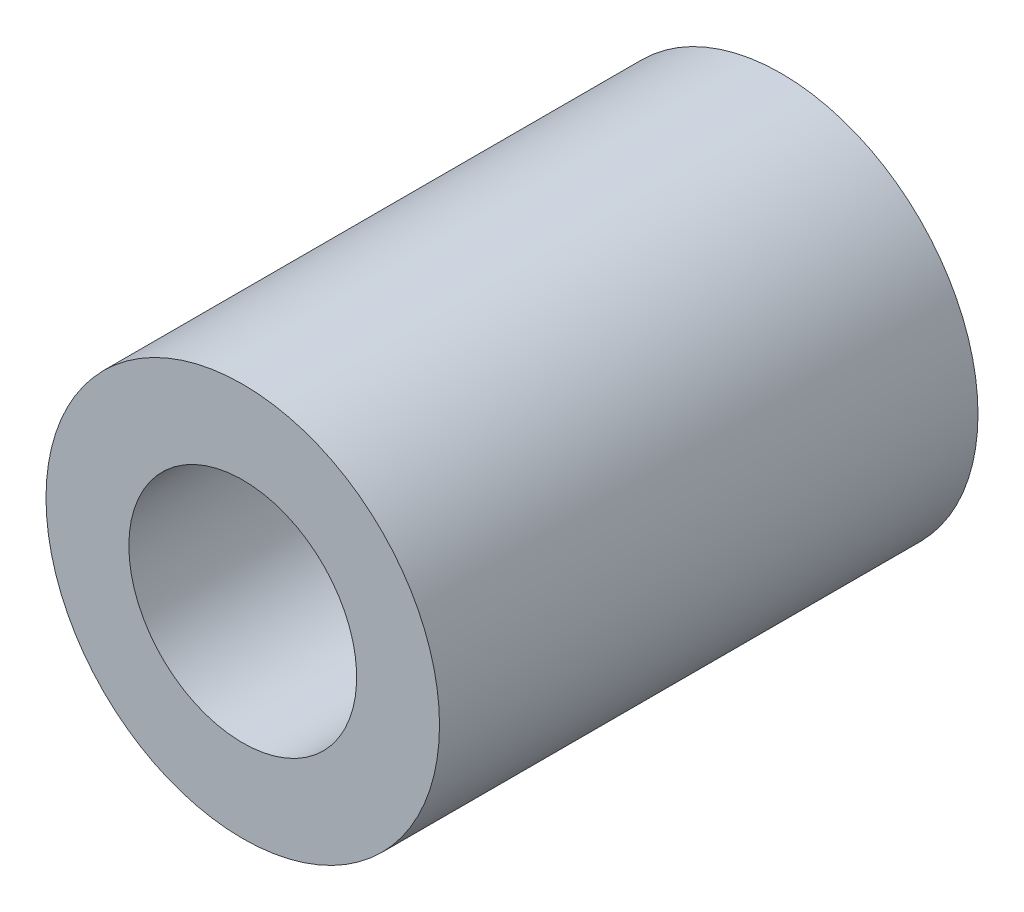
ISO-10303-21;
HEADER;
FILE_DESCRIPTION(('STEP AP214'),'2;1');
FILE_NAME('part.step','',(''),(''),'','','');
FILE_SCHEMA(('AUTOMOTIVE_DESIGN { 1 0 10303 214 1 1 1 1 }'));
ENDSEC;
DATA;
#1=APPLICATION_CONTEXT('core data for automotive mechanical design processes');
#2=APPLICATION_PROTOCOL_DEFINITION('international standard','automotive_design',2000,#1);
#3=PRODUCT_CONTEXT('',#1,'mechanical');
#4=PRODUCT('Part','Part','',(#3));
#5=PRODUCT_RELATED_PRODUCT_CATEGORY('part','',(#4));
#6=PRODUCT_DEFINITION_FORMATION('','',#4);
#7=PRODUCT_DEFINITION_CONTEXT('part definition',#1,'design');
#8=PRODUCT_DEFINITION('design','',#6,#7);
#9=PRODUCT_DEFINITION_SHAPE('','',#8);
#10=(LENGTH_UNIT() NAMED_UNIT(*) SI_UNIT(.MILLI.,.METRE.));
#11=(NAMED_UNIT(*) PLANE_ANGLE_UNIT() SI_UNIT($,.RADIAN.));
#12=(NAMED_UNIT(*) SI_UNIT($,.STERADIAN.) SOLID_ANGLE_UNIT());
#13=UNCERTAINTY_MEASURE_WITH_UNIT(LENGTH_MEASURE(1.E-05),#10,'distance_accuracy_value','');
#14=(GEOMETRIC_REPRESENTATION_CONTEXT(3) GLOBAL_UNCERTAINTY_ASSIGNED_CONTEXT((#13)) GLOBAL_UNIT_ASSIGNED_CONTEXT((#10,
#11,#12)) REPRESENTATION_CONTEXT('',''));
#15=CARTESIAN_POINT('',(0.,0.,0.));
#16=DIRECTION('',(0.,0.,1.));
#17=DIRECTION('',(1.,0.,0.));
#18=AXIS2_PLACEMENT_3D('',#15,#16,#17);
#19=CARTESIAN_POINT('',(0.,0.,13.));
#20=DIRECTION('',(0.,0.,1.));
#21=DIRECTION('',(1.,0.,0.));
#22=AXIS2_PLACEMENT_3D('',#19,#20,#21);
#23=PLANE('',#22);
#24=CARTESIAN_POINT('',(0.,0.,13.));
#25=DIRECTION('',(0.,0.,1.));
#26=DIRECTION('',(1.,0.,0.));
#27=AXIS2_PLACEMENT_3D('',#24,#25,#26);
#28=CIRCLE('',#27,4.75);
#29=CARTESIAN_POINT('',(-4.75,0.,13.));
#30=VERTEX_POINT('',#29);
#31=EDGE_CURVE('E10',#30,#30,#28,.T.);
#32=ORIENTED_EDGE('',*,*,#31,.T.);
#33=EDGE_LOOP('',(#32));
#34=FACE_BOUND('',#33,.T.);
#35=CARTESIAN_POINT('',(0.,0.,13.));
#36=DIRECTION('',(0.,0.,1.));
#37=DIRECTION('',(1.,0.,0.));
#38=AXIS2_PLACEMENT_3D('',#35,#36,#37);
#39=CIRCLE('',#38,2.75);
#40=CARTESIAN_POINT('',(-2.75,0.,13.));
#41=VERTEX_POINT('',#40);
#42=EDGE_CURVE('E50',#41,#41,#39,.T.);
#43=ORIENTED_EDGE('',*,*,#42,.F.);
#44=EDGE_LOOP('',(#43));
#45=FACE_BOUND('',#44,.T.);
#46=ADVANCED_FACE('F37',(#34,#45),#23,.T.);
#47=CARTESIAN_POINT('',(0.,0.,0.));
#48=DIRECTION('',(0.,0.,1.));
#49=DIRECTION('',(1.,0.,0.));
#50=AXIS2_PLACEMENT_3D('',#47,#48,#49);
#51=PLANE('',#50);
#52=CARTESIAN_POINT('',(0.,0.,0.));
#53=DIRECTION('',(0.,0.,1.));
#54=DIRECTION('',(1.,0.,0.));
#55=AXIS2_PLACEMENT_3D('',#52,#53,#54);
#56=CIRCLE('',#55,4.75);
#57=CARTESIAN_POINT('',(-4.75,0.,0.));
#58=VERTEX_POINT('',#57);
#59=EDGE_CURVE('E41',#58,#58,#56,.T.);
#60=ORIENTED_EDGE('',*,*,#59,.F.);
#61=EDGE_LOOP('',(#60));
#62=FACE_BOUND('',#61,.T.);
#63=CARTESIAN_POINT('',(0.,0.,0.));
#64=DIRECTION('',(0.,0.,1.));
#65=DIRECTION('',(1.,0.,0.));
#66=AXIS2_PLACEMENT_3D('',#63,#64,#65);
#67=CIRCLE('',#66,2.75);
#68=CARTESIAN_POINT('',(-2.75,0.,0.));
#69=VERTEX_POINT('',#68);
#70=EDGE_CURVE('E52',#69,#69,#67,.T.);
#71=ORIENTED_EDGE('',*,*,#70,.T.);
#72=EDGE_LOOP('',(#71));
#73=FACE_BOUND('',#72,.T.);
#74=ADVANCED_FACE('F64',(#62,#73),#51,.F.);
#75=CARTESIAN_POINT('',(0.,0.,13.));
#76=DIRECTION('',(0.,0.,-1.));
#77=DIRECTION('',(-1.,0.,0.));
#78=AXIS2_PLACEMENT_3D('',#75,#76,#77);
#79=CYLINDRICAL_SURFACE('',#78,4.75);
#80=CARTESIAN_POINT('',(-4.75,0.,13.));
#81=CARTESIAN_POINT('',(-4.75,0.,12.8645833333333));
#82=CARTESIAN_POINT('',(-4.75,0.,12.7291666666667));
#83=CARTESIAN_POINT('',(-4.75,0.,12.4583333333333));
#84=CARTESIAN_POINT('',(-4.75,0.,12.3229166666667));
#85=CARTESIAN_POINT('',(-4.75,0.,12.0520833333333));
#86=CARTESIAN_POINT('',(-4.75,0.,11.9166666666667));
#87=CARTESIAN_POINT('',(-4.75,0.,11.6458333333333));
#88=CARTESIAN_POINT('',(-4.75,0.,11.5104166666667));
#89=CARTESIAN_POINT('',(-4.75,0.,11.2395833333333));
#90=CARTESIAN_POINT('',(-4.75,0.,11.1041666666667));
#91=CARTESIAN_POINT('',(-4.75,0.,10.8333333333333));
#92=CARTESIAN_POINT('',(-4.75,0.,10.6979166666667));
#93=CARTESIAN_POINT('',(-4.75,0.,10.4270833333333));
#94=CARTESIAN_POINT('',(-4.75,0.,10.2916666666667));
#95=CARTESIAN_POINT('',(-4.75,0.,10.0208333333333));
#96=CARTESIAN_POINT('',(-4.75,0.,9.88541666666667));
#97=CARTESIAN_POINT('',(-4.75,0.,9.61458333333333));
#98=CARTESIAN_POINT('',(-4.75,0.,9.47916666666667));
#99=CARTESIAN_POINT('',(-4.75,0.,9.20833333333333));
#100=CARTESIAN_POINT('',(-4.75,0.,9.07291666666666));
#101=CARTESIAN_POINT('',(-4.75,0.,8.80208333333333));
#102=CARTESIAN_POINT('',(-4.75,0.,8.66666666666667));
#103=CARTESIAN_POINT('',(-4.75,0.,8.39583333333333));
#104=CARTESIAN_POINT('',(-4.75,0.,8.26041666666667));
#105=CARTESIAN_POINT('',(-4.75,0.,7.98958333333333));
#106=CARTESIAN_POINT('',(-4.75,0.,7.85416666666667));
#107=CARTESIAN_POINT('',(-4.75,0.,7.58333333333333));
#108=CARTESIAN_POINT('',(-4.75,0.,7.44791666666667));
#109=CARTESIAN_POINT('',(-4.75,0.,7.17708333333333));
#110=CARTESIAN_POINT('',(-4.75,0.,7.04166666666667));
#111=CARTESIAN_POINT('',(-4.75,0.,6.77083333333333));
#112=CARTESIAN_POINT('',(-4.75,0.,6.63541666666667));
#113=CARTESIAN_POINT('',(-4.75,0.,6.36458333333333));
#114=CARTESIAN_POINT('',(-4.75,0.,6.22916666666667));
#115=CARTESIAN_POINT('',(-4.75,0.,5.95833333333333));
#116=CARTESIAN_POINT('',(-4.75,0.,5.82291666666667));
#117=CARTESIAN_POINT('',(-4.75,0.,5.55208333333333));
#118=CARTESIAN_POINT('',(-4.75,0.,5.41666666666667));
#119=CARTESIAN_POINT('',(-4.75,0.,5.14583333333333));
#120=CARTESIAN_POINT('',(-4.75,0.,5.01041666666667));
#121=CARTESIAN_POINT('',(-4.75,0.,4.73958333333333));
#122=CARTESIAN_POINT('',(-4.75,0.,4.60416666666667));
#123=CARTESIAN_POINT('',(-4.75,0.,4.33333333333333));
#124=CARTESIAN_POINT('',(-4.75,0.,4.19791666666667));
#125=CARTESIAN_POINT('',(-4.75,0.,3.92708333333333));
#126=CARTESIAN_POINT('',(-4.75,0.,3.79166666666667));
#127=CARTESIAN_POINT('',(-4.75,0.,3.52083333333333));
#128=CARTESIAN_POINT('',(-4.75,0.,3.38541666666667));
#129=CARTESIAN_POINT('',(-4.75,0.,3.11458333333333));
#130=CARTESIAN_POINT('',(-4.75,0.,2.97916666666667));
#131=CARTESIAN_POINT('',(-4.75,0.,2.70833333333333));
#132=CARTESIAN_POINT('',(-4.75,0.,2.57291666666667));
#133=CARTESIAN_POINT('',(-4.75,0.,2.30208333333333));
#134=CARTESIAN_POINT('',(-4.75,0.,2.16666666666667));
#135=CARTESIAN_POINT('',(-4.75,0.,1.89583333333333));
#136=CARTESIAN_POINT('',(-4.75,0.,1.76041666666667));
#137=CARTESIAN_POINT('',(-4.75,0.,1.48958333333333));
#138=CARTESIAN_POINT('',(-4.75,0.,1.35416666666667));
#139=CARTESIAN_POINT('',(-4.75,0.,1.08333333333333));
#140=CARTESIAN_POINT('',(-4.75,0.,0.947916666666667));
#141=CARTESIAN_POINT('',(-4.75,0.,0.677083333333334));
#142=CARTESIAN_POINT('',(-4.75,0.,0.541666666666667));
#143=CARTESIAN_POINT('',(-4.75,0.,0.270833333333334));
#144=CARTESIAN_POINT('',(-4.75,0.,0.135416666666667));
#145=CARTESIAN_POINT('',(-4.75,0.,0.));
#146=B_SPLINE_CURVE_WITH_KNOTS('',3,(#80,#81,#82,#83,#84,#85,#86,#87,#88,#89,#90,#91,#92,#93,
#94,#95,#96,#97,#98,#99,#100,#101,#102,#103,#104,#105,#106,#107,#108,#109,#110,#111,#112,#113,
#114,#115,#116,#117,#118,#119,#120,#121,#122,#123,#124,#125,#126,#127,#128,#129,#130,#131,#132,
#133,#134,#135,#136,#137,#138,#139,#140,#141,#142,#143,#144,#145),.UNSPECIFIED.,.F.,.F.,(4,2,2,
2,2,2,2,2,2,2,2,2,2,2,2,2,2,2,2,2,2,2,2,2,2,2,2,2,2,2,2,2,4),(0.,0.40625,0.812500000000001,
1.21875,1.625,2.03125,2.4375,2.84375,3.25,3.65625,4.0625,4.46875,4.875,5.28125,5.6875,6.09375,
6.5,6.90625,7.3125,7.71875,8.125,8.53125,8.9375,9.34375,9.75,10.15625,10.5625,10.96875,11.375,
11.78125,12.1875,12.59375,13.),.UNSPECIFIED.);
#147=EDGE_CURVE('BSEAM39',#30,#58,#146,.T.);
#148=ORIENTED_EDGE('',*,*,#31,.F.);
#149=ORIENTED_EDGE('',*,*,#59,.T.);
#150=ORIENTED_EDGE('',*,*,#147,.T.);
#151=ORIENTED_EDGE('',*,*,#147,.F.);
#152=EDGE_LOOP('',(#148,#150,#149,#151));
#153=FACE_BOUND('',#152,.T.);
#154=ADVANCED_FACE('F39',(#153),#79,.T.);
#155=CARTESIAN_POINT('',(0.,0.,13.));
#156=DIRECTION('',(0.,0.,-1.));
#157=DIRECTION('',(-1.,0.,0.));
#158=AXIS2_PLACEMENT_3D('',#155,#156,#157);
#159=CYLINDRICAL_SURFACE('',#158,2.75);
#160=CARTESIAN_POINT('',(-2.75,0.,13.));
#161=CARTESIAN_POINT('',(-2.75,0.,12.8645833333333));
#162=CARTESIAN_POINT('',(-2.75,0.,12.7291666666667));
#163=CARTESIAN_POINT('',(-2.75,0.,12.4583333333333));
#164=CARTESIAN_POINT('',(-2.75,0.,12.3229166666667));
#165=CARTESIAN_POINT('',(-2.75,0.,12.0520833333333));
#166=CARTESIAN_POINT('',(-2.75,0.,11.9166666666667));
#167=CARTESIAN_POINT('',(-2.75,0.,11.6458333333333));
#168=CARTESIAN_POINT('',(-2.75,0.,11.5104166666667));
#169=CARTESIAN_POINT('',(-2.75,0.,11.2395833333333));
#170=CARTESIAN_POINT('',(-2.75,0.,11.1041666666667));
#171=CARTESIAN_POINT('',(-2.75,0.,10.8333333333333));
#172=CARTESIAN_POINT('',(-2.75,0.,10.6979166666667));
#173=CARTESIAN_POINT('',(-2.75,0.,10.4270833333333));
#174=CARTESIAN_POINT('',(-2.75,0.,10.2916666666667));
#175=CARTESIAN_POINT('',(-2.75,0.,10.0208333333333));
#176=CARTESIAN_POINT('',(-2.75,0.,9.88541666666667));
#177=CARTESIAN_POINT('',(-2.75,0.,9.61458333333333));
#178=CARTESIAN_POINT('',(-2.75,0.,9.47916666666667));
#179=CARTESIAN_POINT('',(-2.75,0.,9.20833333333333));
#180=CARTESIAN_POINT('',(-2.75,0.,9.07291666666667));
#181=CARTESIAN_POINT('',(-2.75,0.,8.80208333333333));
#182=CARTESIAN_POINT('',(-2.75,0.,8.66666666666667));
#183=CARTESIAN_POINT('',(-2.75,0.,8.39583333333333));
#184=CARTESIAN_POINT('',(-2.75,0.,8.26041666666667));
#185=CARTESIAN_POINT('',(-2.75,0.,7.98958333333333));
#186=CARTESIAN_POINT('',(-2.75,0.,7.85416666666667));
#187=CARTESIAN_POINT('',(-2.75,0.,7.58333333333333));
#188=CARTESIAN_POINT('',(-2.75,0.,7.44791666666667));
#189=CARTESIAN_POINT('',(-2.75,0.,7.17708333333333));
#190=CARTESIAN_POINT('',(-2.75,0.,7.04166666666667));
#191=CARTESIAN_POINT('',(-2.75,0.,6.77083333333333));
#192=CARTESIAN_POINT('',(-2.75,0.,6.63541666666667));
#193=CARTESIAN_POINT('',(-2.75,0.,6.36458333333333));
#194=CARTESIAN_POINT('',(-2.75,0.,6.22916666666667));
#195=CARTESIAN_POINT('',(-2.75,0.,5.95833333333333));
#196=CARTESIAN_POINT('',(-2.75,0.,5.82291666666667));
#197=CARTESIAN_POINT('',(-2.75,0.,5.55208333333333));
#198=CARTESIAN_POINT('',(-2.75,0.,5.41666666666667));
#199=CARTESIAN_POINT('',(-2.75,0.,5.14583333333333));
#200=CARTESIAN_POINT('',(-2.75,0.,5.01041666666667));
#201=CARTESIAN_POINT('',(-2.75,0.,4.73958333333333));
#202=CARTESIAN_POINT('',(-2.75,0.,4.60416666666667));
#203=CARTESIAN_POINT('',(-2.75,0.,4.33333333333333));
#204=CARTESIAN_POINT('',(-2.75,0.,4.19791666666667));
#205=CARTESIAN_POINT('',(-2.75,0.,3.92708333333333));
#206=CARTESIAN_POINT('',(-2.75,0.,3.79166666666667));
#207=CARTESIAN_POINT('',(-2.75,0.,3.52083333333333));
#208=CARTESIAN_POINT('',(-2.75,0.,3.38541666666667));
#209=CARTESIAN_POINT('',(-2.75,0.,3.11458333333333));
#210=CARTESIAN_POINT('',(-2.75,0.,2.97916666666667));
#211=CARTESIAN_POINT('',(-2.75,0.,2.70833333333333));
#212=CARTESIAN_POINT('',(-2.75,0.,2.57291666666667));
#213=CARTESIAN_POINT('',(-2.75,0.,2.30208333333333));
#214=CARTESIAN_POINT('',(-2.75,0.,2.16666666666667));
#215=CARTESIAN_POINT('',(-2.75,0.,1.89583333333333));
#216=CARTESIAN_POINT('',(-2.75,0.,1.76041666666667));
#217=CARTESIAN_POINT('',(-2.75,0.,1.48958333333333));
#218=CARTESIAN_POINT('',(-2.75,0.,1.35416666666667));
#219=CARTESIAN_POINT('',(-2.75,0.,1.08333333333333));
#220=CARTESIAN_POINT('',(-2.75,0.,0.947916666666667));
#221=CARTESIAN_POINT('',(-2.75,0.,0.677083333333334));
#222=CARTESIAN_POINT('',(-2.75,0.,0.541666666666667));
#223=CARTESIAN_POINT('',(-2.75,0.,0.270833333333334));
#224=CARTESIAN_POINT('',(-2.75,0.,0.135416666666667));
#225=CARTESIAN_POINT('',(-2.75,0.,0.));
#226=B_SPLINE_CURVE_WITH_KNOTS('',3,(#160,#161,#162,#163,#164,#165,#166,#167,#168,#169,#170,
#171,#172,#173,#174,#175,#176,#177,#178,#179,#180,#181,#182,#183,#184,#185,#186,#187,#188,#189,
#190,#191,#192,#193,#194,#195,#196,#197,#198,#199,#200,#201,#202,#203,#204,#205,#206,#207,#208,
#209,#210,#211,#212,#213,#214,#215,#216,#217,#218,#219,#220,#221,#222,#223,#224,#225),
.UNSPECIFIED.,.F.,.F.,(4,2,2,2,2,2,2,2,2,2,2,2,2,2,2,2,2,2,2,2,2,2,2,2,2,2,2,2,2,2,2,2,4),(0.,
0.406249999999999,0.812499999999999,1.21875,1.625,2.03125,2.4375,2.84375,3.25,3.65625,4.0625,
4.46875,4.875,5.28125,5.6875,6.09375,6.5,6.90625,7.3125,7.71875,8.125,8.53125,8.9375,9.34375,
9.75,10.15625,10.5625,10.96875,11.375,11.78125,12.1875,12.59375,13.),.UNSPECIFIED.);
#227=EDGE_CURVE('BSEAM60',#41,#69,#226,.T.);
#228=ORIENTED_EDGE('',*,*,#42,.T.);
#229=ORIENTED_EDGE('',*,*,#70,.F.);
#230=ORIENTED_EDGE('',*,*,#227,.T.);
#231=ORIENTED_EDGE('',*,*,#227,.F.);
#232=EDGE_LOOP('',(#228,#230,#229,#231));
#233=FACE_BOUND('',#232,.T.);
#234=ADVANCED_FACE('F60',(#233),#159,.F.);
#235=CLOSED_SHELL('',(#46,#74,#154,#234));
#236=MANIFOLD_SOLID_BREP('B2',#235);
#237=ADVANCED_BREP_SHAPE_REPRESENTATION('',(#18,#236),#14);
#238=SHAPE_DEFINITION_REPRESENTATION(#9,#237);
ENDSEC;
END-ISO-10303-21;
